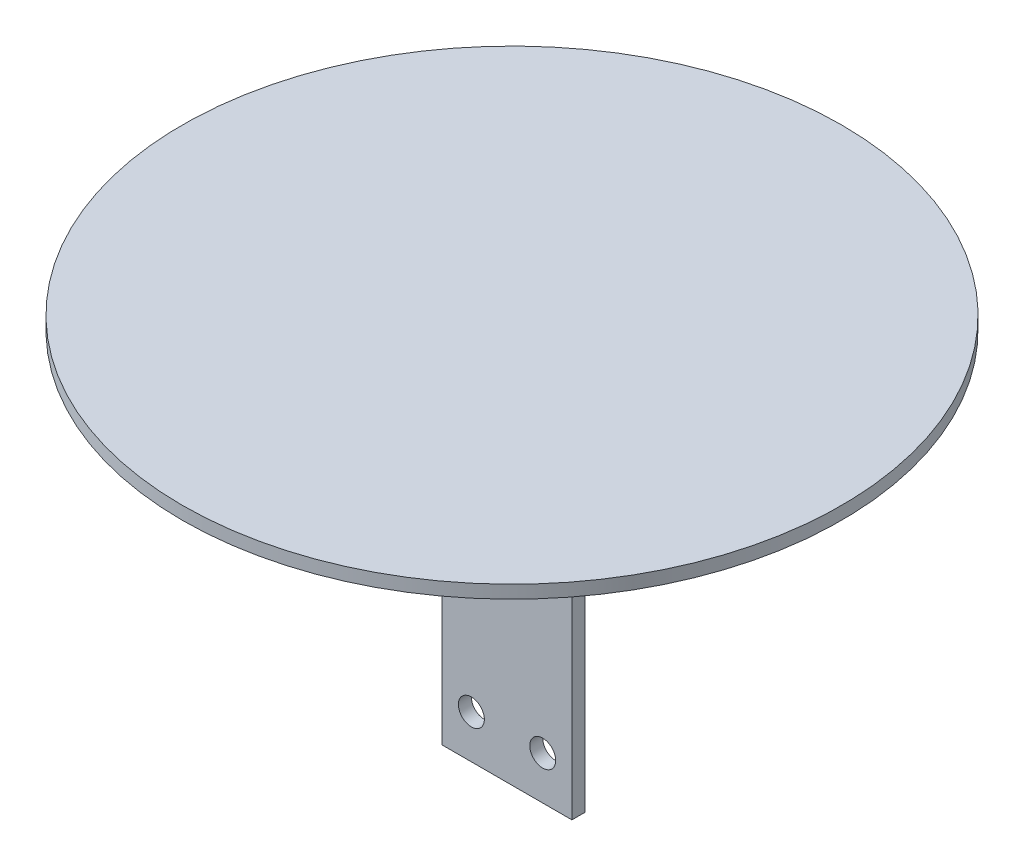
ISO-10303-21;
HEADER;
FILE_DESCRIPTION(('STEP AP214'),'2;1');
FILE_NAME('part.step','',(''),(''),'','','');
FILE_SCHEMA(('AUTOMOTIVE_DESIGN { 1 0 10303 214 1 1 1 1 }'));
ENDSEC;
DATA;
#1=APPLICATION_CONTEXT('core data for automotive mechanical design processes');
#2=APPLICATION_PROTOCOL_DEFINITION('international standard','automotive_design',2000,#1);
#3=PRODUCT_CONTEXT('',#1,'mechanical');
#4=PRODUCT('Part','Part','',(#3));
#5=PRODUCT_RELATED_PRODUCT_CATEGORY('part','',(#4));
#6=PRODUCT_DEFINITION_FORMATION('','',#4);
#7=PRODUCT_DEFINITION_CONTEXT('part definition',#1,'design');
#8=PRODUCT_DEFINITION('design','',#6,#7);
#9=PRODUCT_DEFINITION_SHAPE('','',#8);
#10=(LENGTH_UNIT() NAMED_UNIT(*) SI_UNIT(.MILLI.,.METRE.));
#11=(NAMED_UNIT(*) PLANE_ANGLE_UNIT() SI_UNIT($,.RADIAN.));
#12=(NAMED_UNIT(*) SI_UNIT($,.STERADIAN.) SOLID_ANGLE_UNIT());
#13=UNCERTAINTY_MEASURE_WITH_UNIT(LENGTH_MEASURE(1.E-05),#10,'distance_accuracy_value','');
#14=(GEOMETRIC_REPRESENTATION_CONTEXT(3) GLOBAL_UNCERTAINTY_ASSIGNED_CONTEXT((#13)) GLOBAL_UNIT_ASSIGNED_CONTEXT((#10,
#11,#12)) REPRESENTATION_CONTEXT('',''));
#15=CARTESIAN_POINT('',(0.,0.,0.));
#16=DIRECTION('',(0.,0.,1.));
#17=DIRECTION('',(1.,0.,0.));
#18=AXIS2_PLACEMENT_3D('',#15,#16,#17);
#19=CARTESIAN_POINT('',(0.,45.,1.85531865424868));
#20=DIRECTION('',(0.,1.,0.));
#21=DIRECTION('',(0.,0.,1.));
#22=AXIS2_PLACEMENT_3D('',#19,#20,#21);
#23=PLANE('',#22);
#24=CARTESIAN_POINT('',(0.,45.,1.85531865424868));
#25=DIRECTION('',(0.,1.,0.));
#26=DIRECTION('',(0.,0.,1.));
#27=AXIS2_PLACEMENT_3D('',#24,#25,#26);
#28=CIRCLE('',#27,76.2);
#29=CARTESIAN_POINT('',(0.,45.,78.0553186542487));
#30=VERTEX_POINT('',#29);
#31=EDGE_CURVE('E241',#30,#30,#28,.T.);
#32=ORIENTED_EDGE('',*,*,#31,.F.);
#33=EDGE_LOOP('',(#32));
#34=FACE_BOUND('',#33,.T.);
#35=DIRECTION('',(0.,0.,-1.));
#36=VECTOR('',#35,1.);
#37=CARTESIAN_POINT('',(-15.,45.,3.));
#38=LINE('',#37,#36);
#39=CARTESIAN_POINT('',(-15.,45.,21.5));
#40=VERTEX_POINT('',#39);
#41=CARTESIAN_POINT('',(-15.,45.,-18.5));
#42=VERTEX_POINT('',#41);
#43=EDGE_CURVE('E53',#40,#42,#38,.T.);
#44=ORIENTED_EDGE('',*,*,#43,.F.);
#45=DIRECTION('',(-1.,0.,0.));
#46=VECTOR('',#45,1.);
#47=CARTESIAN_POINT('',(-12.,45.,21.5));
#48=LINE('',#47,#46);
#49=CARTESIAN_POINT('',(-12.,45.,21.5));
#50=VERTEX_POINT('',#49);
#51=EDGE_CURVE('E188',#50,#40,#48,.T.);
#52=ORIENTED_EDGE('',*,*,#51,.F.);
#53=DIRECTION('',(0.,0.,-1.));
#54=VECTOR('',#53,1.);
#55=CARTESIAN_POINT('',(-12.,45.,-18.5));
#56=LINE('',#55,#54);
#57=CARTESIAN_POINT('',(-12.,45.,3.));
#58=VERTEX_POINT('',#57);
#59=EDGE_CURVE('E163',#50,#58,#56,.T.);
#60=ORIENTED_EDGE('',*,*,#59,.T.);
#61=DIRECTION('',(-1.,0.,0.));
#62=VECTOR('',#61,1.);
#63=CARTESIAN_POINT('',(-15.,45.,3.));
#64=LINE('',#63,#62);
#65=CARTESIAN_POINT('',(12.,45.,3.00000000000001));
#66=VERTEX_POINT('',#65);
#67=EDGE_CURVE('E274',#66,#58,#64,.T.);
#68=ORIENTED_EDGE('',*,*,#67,.F.);
#69=DIRECTION('',(0.,0.,1.));
#70=VECTOR('',#69,1.);
#71=CARTESIAN_POINT('',(12.,45.,21.5));
#72=LINE('',#71,#70);
#73=CARTESIAN_POINT('',(12.,45.,21.5));
#74=VERTEX_POINT('',#73);
#75=EDGE_CURVE('E214',#66,#74,#72,.T.);
#76=ORIENTED_EDGE('',*,*,#75,.T.);
#77=DIRECTION('',(1.,0.,0.));
#78=VECTOR('',#77,1.);
#79=CARTESIAN_POINT('',(12.,45.,21.5));
#80=LINE('',#79,#78);
#81=CARTESIAN_POINT('',(15.,45.,21.5));
#82=VERTEX_POINT('',#81);
#83=EDGE_CURVE('E221',#74,#82,#80,.T.);
#84=ORIENTED_EDGE('',*,*,#83,.T.);
#85=DIRECTION('',(0.,0.,-1.));
#86=VECTOR('',#85,1.);
#87=CARTESIAN_POINT('',(15.,45.,3.));
#88=LINE('',#87,#86);
#89=CARTESIAN_POINT('',(15.,45.,-18.5));
#90=VERTEX_POINT('',#89);
#91=EDGE_CURVE('E297',#82,#90,#88,.T.);
#92=ORIENTED_EDGE('',*,*,#91,.T.);
#93=DIRECTION('',(1.,0.,0.));
#94=VECTOR('',#93,1.);
#95=CARTESIAN_POINT('',(12.,45.,-18.5));
#96=LINE('',#95,#94);
#97=CARTESIAN_POINT('',(12.,45.,-18.5));
#98=VERTEX_POINT('',#97);
#99=EDGE_CURVE('E229',#98,#90,#96,.T.);
#100=ORIENTED_EDGE('',*,*,#99,.F.);
#101=CARTESIAN_POINT('',(12.,45.,0.));
#102=VERTEX_POINT('',#101);
#103=EDGE_CURVE('E211',#98,#102,#72,.T.);
#104=ORIENTED_EDGE('',*,*,#103,.T.);
#105=DIRECTION('',(-1.,0.,0.));
#106=VECTOR('',#105,1.);
#107=CARTESIAN_POINT('',(-15.,45.,0.));
#108=LINE('',#107,#106);
#109=CARTESIAN_POINT('',(-12.,45.,0.));
#110=VERTEX_POINT('',#109);
#111=EDGE_CURVE('E286',#102,#110,#108,.T.);
#112=ORIENTED_EDGE('',*,*,#111,.T.);
#113=CARTESIAN_POINT('',(-12.,45.,-18.5));
#114=VERTEX_POINT('',#113);
#115=EDGE_CURVE('E61',#110,#114,#56,.T.);
#116=ORIENTED_EDGE('',*,*,#115,.T.);
#117=DIRECTION('',(-1.,0.,0.));
#118=VECTOR('',#117,1.);
#119=CARTESIAN_POINT('',(-12.,45.,-18.5));
#120=LINE('',#119,#118);
#121=EDGE_CURVE('E175',#114,#42,#120,.T.);
#122=ORIENTED_EDGE('',*,*,#121,.T.);
#123=EDGE_LOOP('',(#44,#52,#60,#68,#76,#84,#92,#100,#104,#112,#116,#122));
#124=FACE_BOUND('',#123,.T.);
#125=ADVANCED_FACE('F39',(#34,#124),#23,.F.);
#126=CARTESIAN_POINT('',(0.,0.,3.));
#127=DIRECTION('',(0.,0.,1.));
#128=DIRECTION('',(1.,0.,0.));
#129=AXIS2_PLACEMENT_3D('',#126,#127,#128);
#130=PLANE('',#129);
#131=DIRECTION('',(1.,0.,0.));
#132=VECTOR('',#131,1.);
#133=CARTESIAN_POINT('',(0.,35.,3.));
#134=LINE('',#133,#132);
#135=CARTESIAN_POINT('',(-15.,35.,3.));
#136=VERTEX_POINT('',#135);
#137=CARTESIAN_POINT('',(-12.,35.,3.));
#138=VERTEX_POINT('',#137);
#139=EDGE_CURVE('E198',#136,#138,#134,.T.);
#140=ORIENTED_EDGE('',*,*,#139,.F.);
#141=DIRECTION('',(0.,-1.,0.));
#142=VECTOR('',#141,1.);
#143=CARTESIAN_POINT('',(-15.,45.,3.));
#144=LINE('',#143,#142);
#145=CARTESIAN_POINT('',(-15.,-45.,3.));
#146=VERTEX_POINT('',#145);
#147=EDGE_CURVE('E276',#136,#146,#144,.T.);
#148=ORIENTED_EDGE('',*,*,#147,.T.);
#149=DIRECTION('',(1.,0.,0.));
#150=VECTOR('',#149,1.);
#151=CARTESIAN_POINT('',(-15.,-45.,3.));
#152=LINE('',#151,#150);
#153=CARTESIAN_POINT('',(15.,-45.,3.));
#154=VERTEX_POINT('',#153);
#155=EDGE_CURVE('E281',#146,#154,#152,.T.);
#156=ORIENTED_EDGE('',*,*,#155,.T.);
#157=DIRECTION('',(0.,1.,0.));
#158=VECTOR('',#157,1.);
#159=CARTESIAN_POINT('',(15.,45.,3.));
#160=LINE('',#159,#158);
#161=CARTESIAN_POINT('',(15.,35.,3.));
#162=VERTEX_POINT('',#161);
#163=EDGE_CURVE('E275',#154,#162,#160,.T.);
#164=ORIENTED_EDGE('',*,*,#163,.T.);
#165=DIRECTION('',(1.,0.,0.));
#166=VECTOR('',#165,1.);
#167=CARTESIAN_POINT('',(0.,35.,3.));
#168=LINE('',#167,#166);
#169=CARTESIAN_POINT('',(12.,35.,3.));
#170=VERTEX_POINT('',#169);
#171=EDGE_CURVE('E239',#170,#162,#168,.T.);
#172=ORIENTED_EDGE('',*,*,#171,.F.);
#173=DIRECTION('',(0.,1.,0.));
#174=VECTOR('',#173,1.);
#175=CARTESIAN_POINT('',(12.,0.,3.));
#176=LINE('',#175,#174);
#177=EDGE_CURVE('E237',#170,#66,#176,.T.);
#178=ORIENTED_EDGE('',*,*,#177,.T.);
#179=ORIENTED_EDGE('',*,*,#67,.T.);
#180=DIRECTION('',(0.,-1.,0.));
#181=VECTOR('',#180,1.);
#182=CARTESIAN_POINT('',(-12.,0.,3.));
#183=LINE('',#182,#181);
#184=EDGE_CURVE('E189',#58,#138,#183,.T.);
#185=ORIENTED_EDGE('',*,*,#184,.T.);
#186=EDGE_LOOP('',(#140,#148,#156,#164,#172,#178,#179,#185));
#187=FACE_BOUND('',#186,.T.);
#188=CARTESIAN_POINT('',(-8.25000000000001,-35.,3.));
#189=DIRECTION('',(0.,0.,1.));
#190=DIRECTION('',(1.,0.,0.));
#191=AXIS2_PLACEMENT_3D('',#188,#189,#190);
#192=CIRCLE('',#191,3.);
#193=CARTESIAN_POINT('',(-5.25,-35.,3.));
#194=VERTEX_POINT('',#193);
#195=EDGE_CURVE('E255',#194,#194,#192,.T.);
#196=ORIENTED_EDGE('',*,*,#195,.F.);
#197=EDGE_LOOP('',(#196));
#198=FACE_BOUND('',#197,.T.);
#199=CARTESIAN_POINT('',(-8.25,20.,3.));
#200=DIRECTION('',(0.,0.,1.));
#201=DIRECTION('',(1.,0.,0.));
#202=AXIS2_PLACEMENT_3D('',#199,#200,#201);
#203=CIRCLE('',#202,3.);
#204=CARTESIAN_POINT('',(-5.25,20.,3.));
#205=VERTEX_POINT('',#204);
#206=EDGE_CURVE('E266',#205,#205,#203,.T.);
#207=ORIENTED_EDGE('',*,*,#206,.F.);
#208=EDGE_LOOP('',(#207));
#209=FACE_BOUND('',#208,.T.);
#210=CARTESIAN_POINT('',(8.25,20.,3.));
#211=DIRECTION('',(0.,0.,1.));
#212=DIRECTION('',(1.,0.,0.));
#213=AXIS2_PLACEMENT_3D('',#210,#211,#212);
#214=CIRCLE('',#213,3.);
#215=CARTESIAN_POINT('',(11.25,20.,3.));
#216=VERTEX_POINT('',#215);
#217=EDGE_CURVE('E257',#216,#216,#214,.T.);
#218=ORIENTED_EDGE('',*,*,#217,.F.);
#219=EDGE_LOOP('',(#218));
#220=FACE_BOUND('',#219,.T.);
#221=CARTESIAN_POINT('',(8.25,-35.,3.));
#222=DIRECTION('',(0.,0.,1.));
#223=DIRECTION('',(1.,0.,0.));
#224=AXIS2_PLACEMENT_3D('',#221,#222,#223);
#225=CIRCLE('',#224,3.);
#226=CARTESIAN_POINT('',(11.25,-35.,3.));
#227=VERTEX_POINT('',#226);
#228=EDGE_CURVE('E247',#227,#227,#225,.T.);
#229=ORIENTED_EDGE('',*,*,#228,.F.);
#230=EDGE_LOOP('',(#229));
#231=FACE_BOUND('',#230,.T.);
#232=ADVANCED_FACE('F311',(#187,#198,#209,#220,#231),#130,.T.);
#233=CARTESIAN_POINT('',(0.,0.,0.));
#234=DIRECTION('',(0.,0.,1.));
#235=DIRECTION('',(1.,0.,0.));
#236=AXIS2_PLACEMENT_3D('',#233,#234,#235);
#237=PLANE('',#236);
#238=DIRECTION('',(0.,-1.,0.));
#239=VECTOR('',#238,1.);
#240=CARTESIAN_POINT('',(-15.,45.,0.));
#241=LINE('',#240,#239);
#242=CARTESIAN_POINT('',(-15.,35.,0.));
#243=VERTEX_POINT('',#242);
#244=CARTESIAN_POINT('',(-15.,-45.,0.));
#245=VERTEX_POINT('',#244);
#246=EDGE_CURVE('E287',#243,#245,#241,.T.);
#247=ORIENTED_EDGE('',*,*,#246,.F.);
#248=DIRECTION('',(1.,0.,0.));
#249=VECTOR('',#248,1.);
#250=CARTESIAN_POINT('',(0.,35.,0.));
#251=LINE('',#250,#249);
#252=CARTESIAN_POINT('',(-12.,35.,0.));
#253=VERTEX_POINT('',#252);
#254=EDGE_CURVE('E11',#243,#253,#251,.T.);
#255=ORIENTED_EDGE('',*,*,#254,.T.);
#256=DIRECTION('',(0.,-1.,0.));
#257=VECTOR('',#256,1.);
#258=CARTESIAN_POINT('',(-12.,0.,0.));
#259=LINE('',#258,#257);
#260=EDGE_CURVE('E50',#110,#253,#259,.T.);
#261=ORIENTED_EDGE('',*,*,#260,.F.);
#262=ORIENTED_EDGE('',*,*,#111,.F.);
#263=DIRECTION('',(0.,1.,0.));
#264=VECTOR('',#263,1.);
#265=CARTESIAN_POINT('',(12.,0.,0.));
#266=LINE('',#265,#264);
#267=CARTESIAN_POINT('',(12.,35.,0.));
#268=VERTEX_POINT('',#267);
#269=EDGE_CURVE('E227',#268,#102,#266,.T.);
#270=ORIENTED_EDGE('',*,*,#269,.F.);
#271=DIRECTION('',(1.,0.,0.));
#272=VECTOR('',#271,1.);
#273=CARTESIAN_POINT('',(0.,35.,0.));
#274=LINE('',#273,#272);
#275=CARTESIAN_POINT('',(15.,35.,0.));
#276=VERTEX_POINT('',#275);
#277=EDGE_CURVE('E298',#268,#276,#274,.T.);
#278=ORIENTED_EDGE('',*,*,#277,.T.);
#279=DIRECTION('',(0.,1.,0.));
#280=VECTOR('',#279,1.);
#281=CARTESIAN_POINT('',(15.,45.,0.));
#282=LINE('',#281,#280);
#283=CARTESIAN_POINT('',(15.,-45.,0.));
#284=VERTEX_POINT('',#283);
#285=EDGE_CURVE('E267',#284,#276,#282,.T.);
#286=ORIENTED_EDGE('',*,*,#285,.F.);
#287=DIRECTION('',(1.,0.,0.));
#288=VECTOR('',#287,1.);
#289=CARTESIAN_POINT('',(-15.,-45.,0.));
#290=LINE('',#289,#288);
#291=EDGE_CURVE('E277',#245,#284,#290,.T.);
#292=ORIENTED_EDGE('',*,*,#291,.F.);
#293=EDGE_LOOP('',(#247,#255,#261,#262,#270,#278,#286,#292));
#294=FACE_BOUND('',#293,.T.);
#295=CARTESIAN_POINT('',(-8.25,20.,0.));
#296=DIRECTION('',(0.,0.,1.));
#297=DIRECTION('',(1.,0.,0.));
#298=AXIS2_PLACEMENT_3D('',#295,#296,#297);
#299=CIRCLE('',#298,3.);
#300=CARTESIAN_POINT('',(-5.25,20.,0.));
#301=VERTEX_POINT('',#300);
#302=EDGE_CURVE('E263',#301,#301,#299,.T.);
#303=ORIENTED_EDGE('',*,*,#302,.T.);
#304=EDGE_LOOP('',(#303));
#305=FACE_BOUND('',#304,.T.);
#306=CARTESIAN_POINT('',(8.25,20.,0.));
#307=DIRECTION('',(0.,0.,1.));
#308=DIRECTION('',(1.,0.,0.));
#309=AXIS2_PLACEMENT_3D('',#306,#307,#308);
#310=CIRCLE('',#309,3.);
#311=CARTESIAN_POINT('',(11.25,20.,0.));
#312=VERTEX_POINT('',#311);
#313=EDGE_CURVE('E260',#312,#312,#310,.T.);
#314=ORIENTED_EDGE('',*,*,#313,.T.);
#315=EDGE_LOOP('',(#314));
#316=FACE_BOUND('',#315,.T.);
#317=CARTESIAN_POINT('',(-8.25000000000001,-35.,0.));
#318=DIRECTION('',(0.,0.,1.));
#319=DIRECTION('',(1.,0.,0.));
#320=AXIS2_PLACEMENT_3D('',#317,#318,#319);
#321=CIRCLE('',#320,3.);
#322=CARTESIAN_POINT('',(-5.25,-35.,0.));
#323=VERTEX_POINT('',#322);
#324=EDGE_CURVE('E253',#323,#323,#321,.T.);
#325=ORIENTED_EDGE('',*,*,#324,.T.);
#326=EDGE_LOOP('',(#325));
#327=FACE_BOUND('',#326,.T.);
#328=CARTESIAN_POINT('',(8.25,-35.,0.));
#329=DIRECTION('',(0.,0.,1.));
#330=DIRECTION('',(1.,0.,0.));
#331=AXIS2_PLACEMENT_3D('',#328,#329,#330);
#332=CIRCLE('',#331,3.);
#333=CARTESIAN_POINT('',(11.25,-35.,0.));
#334=VERTEX_POINT('',#333);
#335=EDGE_CURVE('E245',#334,#334,#332,.T.);
#336=ORIENTED_EDGE('',*,*,#335,.T.);
#337=EDGE_LOOP('',(#336));
#338=FACE_BOUND('',#337,.T.);
#339=ADVANCED_FACE('F341',(#294,#305,#316,#327,#338),#237,.F.);
#340=CARTESIAN_POINT('',(15.,45.,3.));
#341=DIRECTION('',(-1.,0.,0.));
#342=DIRECTION('',(0.,-1.,0.));
#343=AXIS2_PLACEMENT_3D('',#340,#341,#342);
#344=PLANE('',#343);
#345=ORIENTED_EDGE('',*,*,#91,.F.);
#346=DIRECTION('',(0.,-1.,0.));
#347=VECTOR('',#346,1.);
#348=CARTESIAN_POINT('',(15.,45.,21.5));
#349=LINE('',#348,#347);
#350=CARTESIAN_POINT('',(15.,35.,21.5));
#351=VERTEX_POINT('',#350);
#352=EDGE_CURVE('E200',#82,#351,#349,.T.);
#353=ORIENTED_EDGE('',*,*,#352,.T.);
#354=DIRECTION('',(0.,0.,-1.));
#355=VECTOR('',#354,1.);
#356=CARTESIAN_POINT('',(15.,35.,21.5));
#357=LINE('',#356,#355);
#358=EDGE_CURVE('E218',#351,#162,#357,.T.);
#359=ORIENTED_EDGE('',*,*,#358,.T.);
#360=ORIENTED_EDGE('',*,*,#163,.F.);
#361=DIRECTION('',(0.,0.,-1.));
#362=VECTOR('',#361,1.);
#363=CARTESIAN_POINT('',(15.,-45.,3.));
#364=LINE('',#363,#362);
#365=EDGE_CURVE('E284',#154,#284,#364,.T.);
#366=ORIENTED_EDGE('',*,*,#365,.T.);
#367=ORIENTED_EDGE('',*,*,#285,.T.);
#368=CARTESIAN_POINT('',(15.,35.,-18.5));
#369=VERTEX_POINT('',#368);
#370=EDGE_CURVE('E217',#276,#369,#357,.T.);
#371=ORIENTED_EDGE('',*,*,#370,.T.);
#372=DIRECTION('',(0.,1.,0.));
#373=VECTOR('',#372,1.);
#374=CARTESIAN_POINT('',(15.,45.,-18.5));
#375=LINE('',#374,#373);
#376=EDGE_CURVE('E204',#369,#90,#375,.T.);
#377=ORIENTED_EDGE('',*,*,#376,.T.);
#378=EDGE_LOOP('',(#345,#353,#359,#360,#366,#367,#371,#377));
#379=FACE_BOUND('',#378,.T.);
#380=ADVANCED_FACE('F41',(#379),#344,.F.);
#381=CARTESIAN_POINT('',(-15.,45.,3.));
#382=DIRECTION('',(1.,0.,0.));
#383=DIRECTION('',(0.,1.,0.));
#384=AXIS2_PLACEMENT_3D('',#381,#382,#383);
#385=PLANE('',#384);
#386=ORIENTED_EDGE('',*,*,#43,.T.);
#387=DIRECTION('',(0.,-1.,0.));
#388=VECTOR('',#387,1.);
#389=CARTESIAN_POINT('',(-15.,45.,-18.5));
#390=LINE('',#389,#388);
#391=CARTESIAN_POINT('',(-15.,35.,-18.5));
#392=VERTEX_POINT('',#391);
#393=EDGE_CURVE('E181',#42,#392,#390,.T.);
#394=ORIENTED_EDGE('',*,*,#393,.T.);
#395=DIRECTION('',(0.,0.,1.));
#396=VECTOR('',#395,1.);
#397=CARTESIAN_POINT('',(-15.,35.,-18.5));
#398=LINE('',#397,#396);
#399=EDGE_CURVE('E157',#392,#243,#398,.T.);
#400=ORIENTED_EDGE('',*,*,#399,.T.);
#401=ORIENTED_EDGE('',*,*,#246,.T.);
#402=DIRECTION('',(0.,0.,-1.));
#403=VECTOR('',#402,1.);
#404=CARTESIAN_POINT('',(-15.,-45.,3.));
#405=LINE('',#404,#403);
#406=EDGE_CURVE('E291',#146,#245,#405,.T.);
#407=ORIENTED_EDGE('',*,*,#406,.F.);
#408=ORIENTED_EDGE('',*,*,#147,.F.);
#409=CARTESIAN_POINT('',(-15.,35.,21.5));
#410=VERTEX_POINT('',#409);
#411=EDGE_CURVE('E183',#136,#410,#398,.T.);
#412=ORIENTED_EDGE('',*,*,#411,.T.);
#413=DIRECTION('',(0.,1.,0.));
#414=VECTOR('',#413,1.);
#415=CARTESIAN_POINT('',(-15.,45.,21.5));
#416=LINE('',#415,#414);
#417=EDGE_CURVE('E176',#410,#40,#416,.T.);
#418=ORIENTED_EDGE('',*,*,#417,.T.);
#419=EDGE_LOOP('',(#386,#394,#400,#401,#407,#408,#412,#418));
#420=FACE_BOUND('',#419,.T.);
#421=ADVANCED_FACE('F367',(#420),#385,.F.);
#422=CARTESIAN_POINT('',(-15.,-45.,3.));
#423=DIRECTION('',(0.,1.,0.));
#424=DIRECTION('',(0.,0.,1.));
#425=AXIS2_PLACEMENT_3D('',#422,#423,#424);
#426=PLANE('',#425);
#427=ORIENTED_EDGE('',*,*,#291,.T.);
#428=ORIENTED_EDGE('',*,*,#365,.F.);
#429=ORIENTED_EDGE('',*,*,#155,.F.);
#430=ORIENTED_EDGE('',*,*,#406,.T.);
#431=EDGE_LOOP('',(#427,#428,#429,#430));
#432=FACE_BOUND('',#431,.T.);
#433=ADVANCED_FACE('F365',(#432),#426,.F.);
#434=CARTESIAN_POINT('',(-8.25,20.,3.));
#435=DIRECTION('',(0.,0.,-1.));
#436=DIRECTION('',(-1.,0.,0.));
#437=AXIS2_PLACEMENT_3D('',#434,#435,#436);
#438=CYLINDRICAL_SURFACE('',#437,3.);
#439=ORIENTED_EDGE('',*,*,#206,.T.);
#440=EDGE_LOOP('',(#439));
#441=FACE_BOUND('',#440,.T.);
#442=ORIENTED_EDGE('',*,*,#302,.F.);
#443=EDGE_LOOP('',(#442));
#444=FACE_BOUND('',#443,.T.);
#445=ADVANCED_FACE('F363',(#441,#444),#438,.F.);
#446=CARTESIAN_POINT('',(8.25,20.,3.));
#447=DIRECTION('',(0.,0.,-1.));
#448=DIRECTION('',(-1.,0.,0.));
#449=AXIS2_PLACEMENT_3D('',#446,#447,#448);
#450=CYLINDRICAL_SURFACE('',#449,3.);
#451=ORIENTED_EDGE('',*,*,#217,.T.);
#452=EDGE_LOOP('',(#451));
#453=FACE_BOUND('',#452,.T.);
#454=ORIENTED_EDGE('',*,*,#313,.F.);
#455=EDGE_LOOP('',(#454));
#456=FACE_BOUND('',#455,.T.);
#457=ADVANCED_FACE('F360',(#453,#456),#450,.F.);
#458=CARTESIAN_POINT('',(-8.25000000000001,-35.,3.));
#459=DIRECTION('',(0.,0.,-1.));
#460=DIRECTION('',(-1.,0.,0.));
#461=AXIS2_PLACEMENT_3D('',#458,#459,#460);
#462=CYLINDRICAL_SURFACE('',#461,3.);
#463=ORIENTED_EDGE('',*,*,#195,.T.);
#464=EDGE_LOOP('',(#463));
#465=FACE_BOUND('',#464,.T.);
#466=ORIENTED_EDGE('',*,*,#324,.F.);
#467=EDGE_LOOP('',(#466));
#468=FACE_BOUND('',#467,.T.);
#469=ADVANCED_FACE('F354',(#465,#468),#462,.F.);
#470=CARTESIAN_POINT('',(8.25,-35.,3.));
#471=DIRECTION('',(0.,0.,-1.));
#472=DIRECTION('',(-1.,0.,0.));
#473=AXIS2_PLACEMENT_3D('',#470,#471,#472);
#474=CYLINDRICAL_SURFACE('',#473,3.);
#475=ORIENTED_EDGE('',*,*,#228,.T.);
#476=EDGE_LOOP('',(#475));
#477=FACE_BOUND('',#476,.T.);
#478=ORIENTED_EDGE('',*,*,#335,.F.);
#479=EDGE_LOOP('',(#478));
#480=FACE_BOUND('',#479,.T.);
#481=ADVANCED_FACE('F349',(#477,#480),#474,.F.);
#482=CARTESIAN_POINT('',(0.,48.,1.85531865424868));
#483=DIRECTION('',(0.,-1.,0.));
#484=DIRECTION('',(0.,0.,-1.));
#485=AXIS2_PLACEMENT_3D('',#482,#483,#484);
#486=CYLINDRICAL_SURFACE('',#485,76.2);
#487=CARTESIAN_POINT('',(0.,48.,1.85531865424868));
#488=DIRECTION('',(0.,1.,0.));
#489=DIRECTION('',(0.,0.,1.));
#490=AXIS2_PLACEMENT_3D('',#487,#488,#489);
#491=CIRCLE('',#490,76.2);
#492=CARTESIAN_POINT('',(0.,48.,78.0553186542487));
#493=VERTEX_POINT('',#492);
#494=EDGE_CURVE('E242',#493,#493,#491,.T.);
#495=ORIENTED_EDGE('',*,*,#494,.F.);
#496=EDGE_LOOP('',(#495));
#497=FACE_BOUND('',#496,.T.);
#498=ORIENTED_EDGE('',*,*,#31,.T.);
#499=EDGE_LOOP('',(#498));
#500=FACE_BOUND('',#499,.T.);
#501=ADVANCED_FACE('F347',(#497,#500),#486,.T.);
#502=CARTESIAN_POINT('',(0.,48.,1.85531865424868));
#503=DIRECTION('',(0.,1.,0.));
#504=DIRECTION('',(0.,0.,1.));
#505=AXIS2_PLACEMENT_3D('',#502,#503,#504);
#506=PLANE('',#505);
#507=ORIENTED_EDGE('',*,*,#494,.T.);
#508=EDGE_LOOP('',(#507));
#509=FACE_BOUND('',#508,.T.);
#510=ADVANCED_FACE('F344',(#509),#506,.T.);
#511=CARTESIAN_POINT('',(12.,45.,-18.5));
#512=DIRECTION('',(0.,0.,-1.));
#513=DIRECTION('',(0.,1.,0.));
#514=AXIS2_PLACEMENT_3D('',#511,#512,#513);
#515=PLANE('',#514);
#516=ORIENTED_EDGE('',*,*,#376,.F.);
#517=DIRECTION('',(1.,0.,0.));
#518=VECTOR('',#517,1.);
#519=CARTESIAN_POINT('',(12.,35.,-18.5));
#520=LINE('',#519,#518);
#521=CARTESIAN_POINT('',(12.,35.,-18.5));
#522=VERTEX_POINT('',#521);
#523=EDGE_CURVE('E231',#522,#369,#520,.T.);
#524=ORIENTED_EDGE('',*,*,#523,.F.);
#525=DIRECTION('',(0.,1.,0.));
#526=VECTOR('',#525,1.);
#527=CARTESIAN_POINT('',(12.,45.,-18.5));
#528=LINE('',#527,#526);
#529=EDGE_CURVE('E208',#522,#98,#528,.T.);
#530=ORIENTED_EDGE('',*,*,#529,.T.);
#531=ORIENTED_EDGE('',*,*,#99,.T.);
#532=EDGE_LOOP('',(#516,#524,#530,#531));
#533=FACE_BOUND('',#532,.T.);
#534=ADVANCED_FACE('F390',(#533),#515,.T.);
#535=CARTESIAN_POINT('',(12.,0.,0.));
#536=DIRECTION('',(1.,0.,0.));
#537=DIRECTION('',(0.,1.,0.));
#538=AXIS2_PLACEMENT_3D('',#535,#536,#537);
#539=PLANE('',#538);
#540=DIRECTION('',(0.,0.,-1.));
#541=VECTOR('',#540,1.);
#542=CARTESIAN_POINT('',(12.,35.,21.5));
#543=LINE('',#542,#541);
#544=EDGE_CURVE('E201',#268,#522,#543,.T.);
#545=ORIENTED_EDGE('',*,*,#544,.F.);
#546=ORIENTED_EDGE('',*,*,#269,.T.);
#547=ORIENTED_EDGE('',*,*,#103,.F.);
#548=ORIENTED_EDGE('',*,*,#529,.F.);
#549=EDGE_LOOP('',(#545,#546,#547,#548));
#550=FACE_BOUND('',#549,.T.);
#551=ADVANCED_FACE('F332',(#550),#539,.F.);
#552=CARTESIAN_POINT('',(12.,35.,21.5));
#553=DIRECTION('',(0.,-1.,0.));
#554=DIRECTION('',(1.,0.,0.));
#555=AXIS2_PLACEMENT_3D('',#552,#553,#554);
#556=PLANE('',#555);
#557=ORIENTED_EDGE('',*,*,#277,.F.);
#558=ORIENTED_EDGE('',*,*,#544,.T.);
#559=ORIENTED_EDGE('',*,*,#523,.T.);
#560=ORIENTED_EDGE('',*,*,#370,.F.);
#561=EDGE_LOOP('',(#557,#558,#559,#560));
#562=FACE_BOUND('',#561,.T.);
#563=ADVANCED_FACE('F322',(#562),#556,.T.);
#564=CARTESIAN_POINT('',(12.,45.,21.5));
#565=DIRECTION('',(0.,0.,1.));
#566=DIRECTION('',(0.,-1.,0.));
#567=AXIS2_PLACEMENT_3D('',#564,#565,#566);
#568=PLANE('',#567);
#569=ORIENTED_EDGE('',*,*,#352,.F.);
#570=ORIENTED_EDGE('',*,*,#83,.F.);
#571=DIRECTION('',(0.,-1.,0.));
#572=VECTOR('',#571,1.);
#573=CARTESIAN_POINT('',(12.,45.,21.5));
#574=LINE('',#573,#572);
#575=CARTESIAN_POINT('',(12.,35.,21.5));
#576=VERTEX_POINT('',#575);
#577=EDGE_CURVE('E199',#74,#576,#574,.T.);
#578=ORIENTED_EDGE('',*,*,#577,.T.);
#579=DIRECTION('',(1.,0.,0.));
#580=VECTOR('',#579,1.);
#581=CARTESIAN_POINT('',(12.,35.,21.5));
#582=LINE('',#581,#580);
#583=EDGE_CURVE('E212',#576,#351,#582,.T.);
#584=ORIENTED_EDGE('',*,*,#583,.T.);
#585=EDGE_LOOP('',(#569,#570,#578,#584));
#586=FACE_BOUND('',#585,.T.);
#587=ADVANCED_FACE('F325',(#586),#568,.T.);
#588=EDGE_CURVE('E202',#576,#170,#543,.T.);
#589=ORIENTED_EDGE('',*,*,#588,.T.);
#590=ORIENTED_EDGE('',*,*,#171,.T.);
#591=ORIENTED_EDGE('',*,*,#358,.F.);
#592=ORIENTED_EDGE('',*,*,#583,.F.);
#593=EDGE_LOOP('',(#589,#590,#591,#592));
#594=FACE_BOUND('',#593,.T.);
#595=ADVANCED_FACE('F318',(#594),#556,.T.);
#596=ORIENTED_EDGE('',*,*,#177,.F.);
#597=ORIENTED_EDGE('',*,*,#588,.F.);
#598=ORIENTED_EDGE('',*,*,#577,.F.);
#599=ORIENTED_EDGE('',*,*,#75,.F.);
#600=EDGE_LOOP('',(#596,#597,#598,#599));
#601=FACE_BOUND('',#600,.T.);
#602=ADVANCED_FACE('F306',(#601),#539,.F.);
#603=CARTESIAN_POINT('',(-12.,0.,0.));
#604=DIRECTION('',(-1.,0.,0.));
#605=DIRECTION('',(0.,-1.,0.));
#606=AXIS2_PLACEMENT_3D('',#603,#604,#605);
#607=PLANE('',#606);
#608=ORIENTED_EDGE('',*,*,#115,.F.);
#609=ORIENTED_EDGE('',*,*,#260,.T.);
#610=DIRECTION('',(0.,0.,1.));
#611=VECTOR('',#610,1.);
#612=CARTESIAN_POINT('',(-12.,35.,-18.5));
#613=LINE('',#612,#611);
#614=CARTESIAN_POINT('',(-12.,35.,-18.5));
#615=VERTEX_POINT('',#614);
#616=EDGE_CURVE('E160',#615,#253,#613,.T.);
#617=ORIENTED_EDGE('',*,*,#616,.F.);
#618=DIRECTION('',(0.,-1.,0.));
#619=VECTOR('',#618,1.);
#620=CARTESIAN_POINT('',(-12.,45.,-18.5));
#621=LINE('',#620,#619);
#622=EDGE_CURVE('E168',#114,#615,#621,.T.);
#623=ORIENTED_EDGE('',*,*,#622,.F.);
#624=EDGE_LOOP('',(#608,#609,#617,#623));
#625=FACE_BOUND('',#624,.T.);
#626=ADVANCED_FACE('F166',(#625),#607,.F.);
#627=CARTESIAN_POINT('',(-12.,35.,-18.5));
#628=DIRECTION('',(0.,-1.,0.));
#629=DIRECTION('',(1.,0.,0.));
#630=AXIS2_PLACEMENT_3D('',#627,#628,#629);
#631=PLANE('',#630);
#632=ORIENTED_EDGE('',*,*,#254,.F.);
#633=ORIENTED_EDGE('',*,*,#399,.F.);
#634=DIRECTION('',(-1.,0.,0.));
#635=VECTOR('',#634,1.);
#636=CARTESIAN_POINT('',(-12.,35.,-18.5));
#637=LINE('',#636,#635);
#638=EDGE_CURVE('E153',#615,#392,#637,.T.);
#639=ORIENTED_EDGE('',*,*,#638,.F.);
#640=ORIENTED_EDGE('',*,*,#616,.T.);
#641=EDGE_LOOP('',(#632,#633,#639,#640));
#642=FACE_BOUND('',#641,.T.);
#643=ADVANCED_FACE('F156',(#642),#631,.T.);
#644=CARTESIAN_POINT('',(-12.,45.,-18.5));
#645=DIRECTION('',(0.,0.,-1.));
#646=DIRECTION('',(0.,1.,0.));
#647=AXIS2_PLACEMENT_3D('',#644,#645,#646);
#648=PLANE('',#647);
#649=ORIENTED_EDGE('',*,*,#393,.F.);
#650=ORIENTED_EDGE('',*,*,#121,.F.);
#651=ORIENTED_EDGE('',*,*,#622,.T.);
#652=ORIENTED_EDGE('',*,*,#638,.T.);
#653=EDGE_LOOP('',(#649,#650,#651,#652));
#654=FACE_BOUND('',#653,.T.);
#655=ADVANCED_FACE('F173',(#654),#648,.T.);
#656=CARTESIAN_POINT('',(-12.,45.,21.5));
#657=DIRECTION('',(0.,0.,1.));
#658=DIRECTION('',(0.,-1.,0.));
#659=AXIS2_PLACEMENT_3D('',#656,#657,#658);
#660=PLANE('',#659);
#661=ORIENTED_EDGE('',*,*,#417,.F.);
#662=DIRECTION('',(-1.,0.,0.));
#663=VECTOR('',#662,1.);
#664=CARTESIAN_POINT('',(-12.,35.,21.5));
#665=LINE('',#664,#663);
#666=CARTESIAN_POINT('',(-12.,35.,21.5));
#667=VERTEX_POINT('',#666);
#668=EDGE_CURVE('E162',#667,#410,#665,.T.);
#669=ORIENTED_EDGE('',*,*,#668,.F.);
#670=DIRECTION('',(0.,1.,0.));
#671=VECTOR('',#670,1.);
#672=CARTESIAN_POINT('',(-12.,45.,21.5));
#673=LINE('',#672,#671);
#674=EDGE_CURVE('E171',#667,#50,#673,.T.);
#675=ORIENTED_EDGE('',*,*,#674,.T.);
#676=ORIENTED_EDGE('',*,*,#51,.T.);
#677=EDGE_LOOP('',(#661,#669,#675,#676));
#678=FACE_BOUND('',#677,.T.);
#679=ADVANCED_FACE('F456',(#678),#660,.T.);
#680=ORIENTED_EDGE('',*,*,#411,.F.);
#681=ORIENTED_EDGE('',*,*,#139,.T.);
#682=EDGE_CURVE('E172',#138,#667,#613,.T.);
#683=ORIENTED_EDGE('',*,*,#682,.T.);
#684=ORIENTED_EDGE('',*,*,#668,.T.);
#685=EDGE_LOOP('',(#680,#681,#683,#684));
#686=FACE_BOUND('',#685,.T.);
#687=ADVANCED_FACE('F450',(#686),#631,.T.);
#688=ORIENTED_EDGE('',*,*,#184,.F.);
#689=ORIENTED_EDGE('',*,*,#59,.F.);
#690=ORIENTED_EDGE('',*,*,#674,.F.);
#691=ORIENTED_EDGE('',*,*,#682,.F.);
#692=EDGE_LOOP('',(#688,#689,#690,#691));
#693=FACE_BOUND('',#692,.T.);
#694=ADVANCED_FACE('F442',(#693),#607,.F.);
#695=CLOSED_SHELL('',(#125,#232,#339,#380,#421,#433,#445,#457,#469,#481,#501,#510,#534,#551,
#563,#587,#595,#602,#626,#643,#655,#679,#687,#694));
#696=MANIFOLD_SOLID_BREP('B2',#695);
#697=ADVANCED_BREP_SHAPE_REPRESENTATION('',(#18,#696),#14);
#698=SHAPE_DEFINITION_REPRESENTATION(#9,#697);
ENDSEC;
END-ISO-10303-21;
